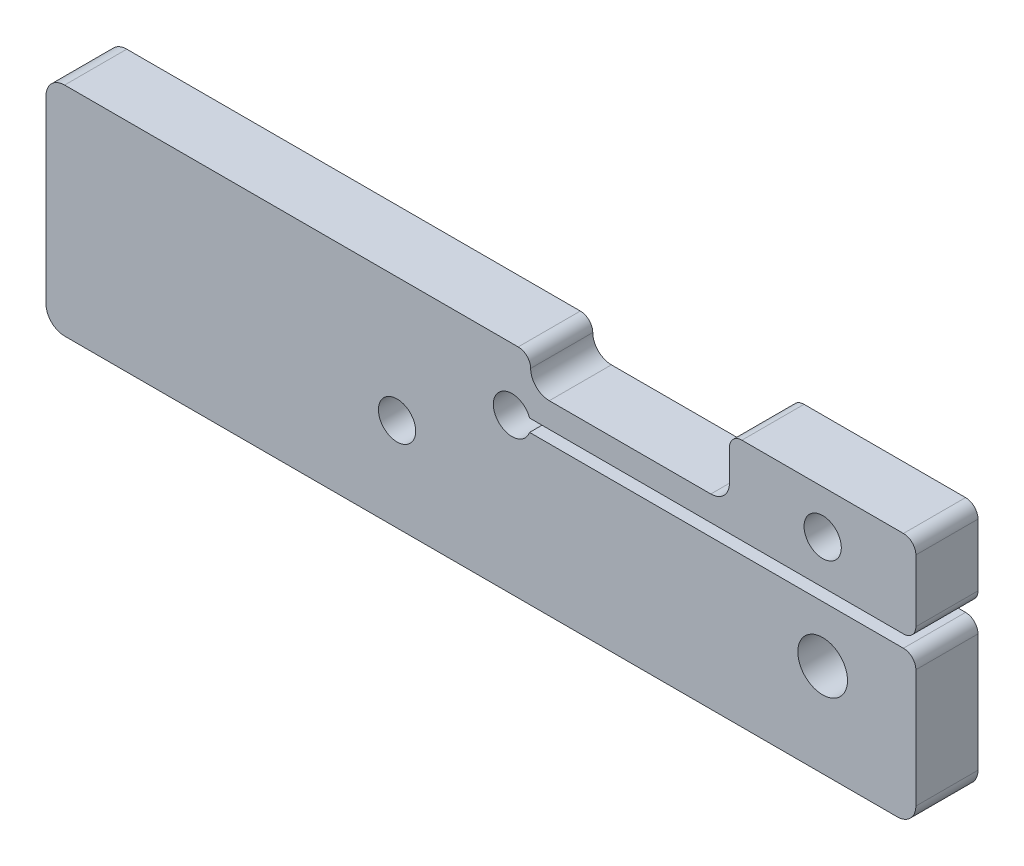
ISO-10303-21;
HEADER;
FILE_DESCRIPTION(('STEP AP214'),'2;1');
FILE_NAME('part.step','',(''),(''),'','','');
FILE_SCHEMA(('AUTOMOTIVE_DESIGN { 1 0 10303 214 1 1 1 1 }'));
ENDSEC;
DATA;
#1=APPLICATION_CONTEXT('core data for automotive mechanical design processes');
#2=APPLICATION_PROTOCOL_DEFINITION('international standard','automotive_design',2000,#1);
#3=PRODUCT_CONTEXT('',#1,'mechanical');
#4=PRODUCT('Part','Part','',(#3));
#5=PRODUCT_RELATED_PRODUCT_CATEGORY('part','',(#4));
#6=PRODUCT_DEFINITION_FORMATION('','',#4);
#7=PRODUCT_DEFINITION_CONTEXT('part definition',#1,'design');
#8=PRODUCT_DEFINITION('design','',#6,#7);
#9=PRODUCT_DEFINITION_SHAPE('','',#8);
#10=(LENGTH_UNIT() NAMED_UNIT(*) SI_UNIT(.MILLI.,.METRE.));
#11=(NAMED_UNIT(*) PLANE_ANGLE_UNIT() SI_UNIT($,.RADIAN.));
#12=(NAMED_UNIT(*) SI_UNIT($,.STERADIAN.) SOLID_ANGLE_UNIT());
#13=UNCERTAINTY_MEASURE_WITH_UNIT(LENGTH_MEASURE(1.E-05),#10,'distance_accuracy_value','');
#14=(GEOMETRIC_REPRESENTATION_CONTEXT(3) GLOBAL_UNCERTAINTY_ASSIGNED_CONTEXT((#13)) GLOBAL_UNIT_ASSIGNED_CONTEXT((#10,
#11,#12)) REPRESENTATION_CONTEXT('',''));
#15=CARTESIAN_POINT('',(0.,0.,0.));
#16=DIRECTION('',(0.,0.,1.));
#17=DIRECTION('',(1.,0.,0.));
#18=AXIS2_PLACEMENT_3D('',#15,#16,#17);
#19=CARTESIAN_POINT('',(140.,0.,30.));
#20=DIRECTION('',(-1.,0.,0.));
#21=DIRECTION('',(0.,0.,1.));
#22=AXIS2_PLACEMENT_3D('',#19,#20,#21);
#23=PLANE('',#22);
#24=DIRECTION('',(0.,0.,1.));
#25=VECTOR('',#24,1.);
#26=CARTESIAN_POINT('',(140.,22.,30.));
#27=LINE('',#26,#25);
#28=CARTESIAN_POINT('',(140.,22.,0.));
#29=VERTEX_POINT('',#28);
#30=CARTESIAN_POINT('',(140.,22.,10.));
#31=VERTEX_POINT('',#30);
#32=EDGE_CURVE('E235',#29,#31,#27,.T.);
#33=ORIENTED_EDGE('',*,*,#32,.T.);
#34=DIRECTION('',(0.,1.,0.));
#35=VECTOR('',#34,1.);
#36=CARTESIAN_POINT('',(140.,0.,10.));
#37=LINE('',#36,#35);
#38=CARTESIAN_POINT('',(140.,3.,10.));
#39=VERTEX_POINT('',#38);
#40=EDGE_CURVE('E449',#39,#31,#37,.T.);
#41=ORIENTED_EDGE('',*,*,#40,.F.);
#42=DIRECTION('',(0.,0.,-1.));
#43=VECTOR('',#42,1.);
#44=CARTESIAN_POINT('',(140.,3.,30.));
#45=LINE('',#44,#43);
#46=CARTESIAN_POINT('',(140.,3.,0.));
#47=VERTEX_POINT('',#46);
#48=EDGE_CURVE('E355',#39,#47,#45,.T.);
#49=ORIENTED_EDGE('',*,*,#48,.T.);
#50=DIRECTION('',(0.,1.,0.));
#51=VECTOR('',#50,1.);
#52=CARTESIAN_POINT('',(140.,0.,0.));
#53=LINE('',#52,#51);
#54=EDGE_CURVE('E325',#47,#29,#53,.T.);
#55=ORIENTED_EDGE('',*,*,#54,.T.);
#56=EDGE_LOOP('',(#33,#41,#49,#55));
#57=FACE_BOUND('',#56,.T.);
#58=ADVANCED_FACE('F32',(#57),#23,.F.);
#59=DIRECTION('',(0.,0.,1.));
#60=VECTOR('',#59,1.);
#61=CARTESIAN_POINT('',(140.,38.,30.));
#62=LINE('',#61,#60);
#63=CARTESIAN_POINT('',(140.,38.,0.));
#64=VERTEX_POINT('',#63);
#65=CARTESIAN_POINT('',(140.,38.,10.));
#66=VERTEX_POINT('',#65);
#67=EDGE_CURVE('E230',#64,#66,#62,.T.);
#68=ORIENTED_EDGE('',*,*,#67,.T.);
#69=CARTESIAN_POINT('',(140.,28.,10.));
#70=VERTEX_POINT('',#69);
#71=EDGE_CURVE('E48',#70,#66,#37,.T.);
#72=ORIENTED_EDGE('',*,*,#71,.F.);
#73=DIRECTION('',(0.,0.,1.));
#74=VECTOR('',#73,1.);
#75=CARTESIAN_POINT('',(140.,28.,30.));
#76=LINE('',#75,#74);
#77=CARTESIAN_POINT('',(140.,28.,0.));
#78=VERTEX_POINT('',#77);
#79=EDGE_CURVE('E233',#70,#78,#76,.F.);
#80=ORIENTED_EDGE('',*,*,#79,.T.);
#81=EDGE_CURVE('E324',#78,#64,#53,.T.);
#82=ORIENTED_EDGE('',*,*,#81,.T.);
#83=EDGE_LOOP('',(#68,#72,#80,#82));
#84=FACE_BOUND('',#83,.T.);
#85=ADVANCED_FACE('F385',(#84),#23,.F.);
#86=CARTESIAN_POINT('',(0.,35.,30.));
#87=DIRECTION('',(0.,-1.,0.));
#88=DIRECTION('',(0.,0.,-1.));
#89=AXIS2_PLACEMENT_3D('',#86,#87,#88);
#90=PLANE('',#89);
#91=DIRECTION('',(0.,0.,-1.));
#92=VECTOR('',#91,1.);
#93=CARTESIAN_POINT('',(3.,35.,30.));
#94=LINE('',#93,#92);
#95=CARTESIAN_POINT('',(3.,35.,0.));
#96=VERTEX_POINT('',#95);
#97=CARTESIAN_POINT('',(3.,35.,10.));
#98=VERTEX_POINT('',#97);
#99=EDGE_CURVE('E206',#96,#98,#94,.F.);
#100=ORIENTED_EDGE('',*,*,#99,.T.);
#101=DIRECTION('',(-1.,0.,0.));
#102=VECTOR('',#101,1.);
#103=CARTESIAN_POINT('',(8.5,35.,10.));
#104=LINE('',#103,#102);
#105=CARTESIAN_POINT('',(76.,35.,10.));
#106=VERTEX_POINT('',#105);
#107=EDGE_CURVE('E182',#106,#98,#104,.T.);
#108=ORIENTED_EDGE('',*,*,#107,.F.);
#109=DIRECTION('',(0.,0.,1.));
#110=VECTOR('',#109,1.);
#111=CARTESIAN_POINT('',(76.,35.,30.));
#112=LINE('',#111,#110);
#113=CARTESIAN_POINT('',(76.,35.,0.));
#114=VERTEX_POINT('',#113);
#115=EDGE_CURVE('E213',#106,#114,#112,.F.);
#116=ORIENTED_EDGE('',*,*,#115,.T.);
#117=DIRECTION('',(-1.,0.,0.));
#118=VECTOR('',#117,1.);
#119=CARTESIAN_POINT('',(0.,35.,0.));
#120=LINE('',#119,#118);
#121=EDGE_CURVE('E328',#114,#96,#120,.T.);
#122=ORIENTED_EDGE('',*,*,#121,.T.);
#123=EDGE_LOOP('',(#100,#108,#116,#122));
#124=FACE_BOUND('',#123,.T.);
#125=ADVANCED_FACE('F381',(#124),#90,.F.);
#126=CARTESIAN_POINT('',(0.,0.,30.));
#127=DIRECTION('',(1.,0.,0.));
#128=DIRECTION('',(0.,0.,-1.));
#129=AXIS2_PLACEMENT_3D('',#126,#127,#128);
#130=PLANE('',#129);
#131=DIRECTION('',(0.,0.,-1.));
#132=VECTOR('',#131,1.);
#133=CARTESIAN_POINT('',(0.,3.,30.));
#134=LINE('',#133,#132);
#135=CARTESIAN_POINT('',(0.,3.,0.));
#136=VERTEX_POINT('',#135);
#137=CARTESIAN_POINT('',(0.,3.,10.));
#138=VERTEX_POINT('',#137);
#139=EDGE_CURVE('E197',#136,#138,#134,.F.);
#140=ORIENTED_EDGE('',*,*,#139,.T.);
#141=DIRECTION('',(0.,-1.,0.));
#142=VECTOR('',#141,1.);
#143=CARTESIAN_POINT('',(0.,0.,10.));
#144=LINE('',#143,#142);
#145=CARTESIAN_POINT('',(0.,32.,10.));
#146=VERTEX_POINT('',#145);
#147=EDGE_CURVE('E180',#146,#138,#144,.T.);
#148=ORIENTED_EDGE('',*,*,#147,.F.);
#149=DIRECTION('',(0.,0.,-1.));
#150=VECTOR('',#149,1.);
#151=CARTESIAN_POINT('',(0.,32.,30.));
#152=LINE('',#151,#150);
#153=CARTESIAN_POINT('',(0.,32.,0.));
#154=VERTEX_POINT('',#153);
#155=EDGE_CURVE('E194',#146,#154,#152,.T.);
#156=ORIENTED_EDGE('',*,*,#155,.T.);
#157=DIRECTION('',(0.,-1.,0.));
#158=VECTOR('',#157,1.);
#159=CARTESIAN_POINT('',(0.,0.,0.));
#160=LINE('',#159,#158);
#161=EDGE_CURVE('E319',#154,#136,#160,.T.);
#162=ORIENTED_EDGE('',*,*,#161,.T.);
#163=EDGE_LOOP('',(#140,#148,#156,#162));
#164=FACE_BOUND('',#163,.T.);
#165=ADVANCED_FACE('F192',(#164),#130,.F.);
#166=CARTESIAN_POINT('',(0.,0.,30.));
#167=DIRECTION('',(0.,1.,0.));
#168=DIRECTION('',(0.,0.,1.));
#169=AXIS2_PLACEMENT_3D('',#166,#167,#168);
#170=PLANE('',#169);
#171=DIRECTION('',(0.,0.,-1.));
#172=VECTOR('',#171,1.);
#173=CARTESIAN_POINT('',(137.,0.,30.));
#174=LINE('',#173,#172);
#175=CARTESIAN_POINT('',(137.,0.,0.));
#176=VERTEX_POINT('',#175);
#177=CARTESIAN_POINT('',(137.,0.,10.));
#178=VERTEX_POINT('',#177);
#179=EDGE_CURVE('E352',#176,#178,#174,.F.);
#180=ORIENTED_EDGE('',*,*,#179,.T.);
#181=DIRECTION('',(1.,0.,0.));
#182=VECTOR('',#181,1.);
#183=CARTESIAN_POINT('',(8.5,0.,10.));
#184=LINE('',#183,#182);
#185=CARTESIAN_POINT('',(3.,0.,10.));
#186=VERTEX_POINT('',#185);
#187=EDGE_CURVE('E316',#186,#178,#184,.T.);
#188=ORIENTED_EDGE('',*,*,#187,.F.);
#189=DIRECTION('',(0.,0.,-1.));
#190=VECTOR('',#189,1.);
#191=CARTESIAN_POINT('',(3.,0.,30.));
#192=LINE('',#191,#190);
#193=CARTESIAN_POINT('',(3.,0.,0.));
#194=VERTEX_POINT('',#193);
#195=EDGE_CURVE('E350',#186,#194,#192,.T.);
#196=ORIENTED_EDGE('',*,*,#195,.T.);
#197=DIRECTION('',(1.,0.,0.));
#198=VECTOR('',#197,1.);
#199=CARTESIAN_POINT('',(0.,0.,0.));
#200=LINE('',#199,#198);
#201=EDGE_CURVE('E321',#194,#176,#200,.T.);
#202=ORIENTED_EDGE('',*,*,#201,.T.);
#203=EDGE_LOOP('',(#180,#188,#196,#202));
#204=FACE_BOUND('',#203,.T.);
#205=ADVANCED_FACE('F372',(#204),#170,.F.);
#206=CARTESIAN_POINT('',(0.,0.,0.));
#207=DIRECTION('',(0.,0.,-1.));
#208=DIRECTION('',(-1.,0.,0.));
#209=AXIS2_PLACEMENT_3D('',#206,#207,#208);
#210=PLANE('',#209);
#211=CARTESIAN_POINT('',(56.5,15.,0.));
#212=DIRECTION('',(0.,0.,1.));
#213=DIRECTION('',(1.,0.,0.));
#214=AXIS2_PLACEMENT_3D('',#211,#212,#213);
#215=CIRCLE('',#214,3.);
#216=CARTESIAN_POINT('',(59.5,15.,0.));
#217=VERTEX_POINT('',#216);
#218=EDGE_CURVE('E294',#217,#217,#215,.T.);
#219=ORIENTED_EDGE('',*,*,#218,.T.);
#220=EDGE_LOOP('',(#219));
#221=FACE_BOUND('',#220,.T.);
#222=CARTESIAN_POINT('',(125.,33.,0.));
#223=DIRECTION('',(0.,0.,1.));
#224=DIRECTION('',(1.,0.,0.));
#225=AXIS2_PLACEMENT_3D('',#222,#223,#224);
#226=CIRCLE('',#225,2.99999999999999);
#227=CARTESIAN_POINT('',(128.,33.,0.));
#228=VERTEX_POINT('',#227);
#229=EDGE_CURVE('E293',#228,#228,#226,.T.);
#230=ORIENTED_EDGE('',*,*,#229,.T.);
#231=EDGE_LOOP('',(#230));
#232=FACE_BOUND('',#231,.T.);
#233=CARTESIAN_POINT('',(125.,15.,0.));
#234=DIRECTION('',(0.,0.,1.));
#235=DIRECTION('',(1.,0.,0.));
#236=AXIS2_PLACEMENT_3D('',#233,#234,#235);
#237=CIRCLE('',#236,3.99999999999996);
#238=CARTESIAN_POINT('',(129.,15.,0.));
#239=VERTEX_POINT('',#238);
#240=EDGE_CURVE('E297',#239,#239,#237,.T.);
#241=ORIENTED_EDGE('',*,*,#240,.T.);
#242=EDGE_LOOP('',(#241));
#243=FACE_BOUND('',#242,.T.);
#244=ORIENTED_EDGE('',*,*,#121,.F.);
#245=CARTESIAN_POINT('',(76.,33.,0.));
#246=DIRECTION('',(0.,0.,-1.));
#247=DIRECTION('',(-1.,0.,0.));
#248=AXIS2_PLACEMENT_3D('',#245,#246,#247);
#249=CIRCLE('',#248,2.);
#250=CARTESIAN_POINT('',(78.,33.,0.));
#251=VERTEX_POINT('',#250);
#252=EDGE_CURVE('E224',#114,#251,#249,.T.);
#253=ORIENTED_EDGE('',*,*,#252,.T.);
#254=CARTESIAN_POINT('',(81.,33.,0.));
#255=DIRECTION('',(0.,0.,-1.));
#256=DIRECTION('',(-1.,0.,0.));
#257=AXIS2_PLACEMENT_3D('',#254,#255,#256);
#258=CIRCLE('',#257,3.);
#259=CARTESIAN_POINT('',(81.,30.,0.));
#260=VERTEX_POINT('',#259);
#261=EDGE_CURVE('E348',#251,#260,#258,.F.);
#262=ORIENTED_EDGE('',*,*,#261,.T.);
#263=DIRECTION('',(1.,0.,0.));
#264=VECTOR('',#263,1.);
#265=CARTESIAN_POINT('',(78.,30.,0.));
#266=LINE('',#265,#264);
#267=CARTESIAN_POINT('',(107.,30.,0.));
#268=VERTEX_POINT('',#267);
#269=EDGE_CURVE('E302',#260,#268,#266,.T.);
#270=ORIENTED_EDGE('',*,*,#269,.T.);
#271=CARTESIAN_POINT('',(107.,33.,0.));
#272=DIRECTION('',(0.,0.,-1.));
#273=DIRECTION('',(-1.,0.,0.));
#274=AXIS2_PLACEMENT_3D('',#271,#272,#273);
#275=CIRCLE('',#274,3.);
#276=CARTESIAN_POINT('',(110.,33.,0.));
#277=VERTEX_POINT('',#276);
#278=EDGE_CURVE('E345',#268,#277,#275,.F.);
#279=ORIENTED_EDGE('',*,*,#278,.T.);
#280=DIRECTION('',(0.,-1.,0.));
#281=VECTOR('',#280,1.);
#282=CARTESIAN_POINT('',(110.,35.,0.));
#283=LINE('',#282,#281);
#284=CARTESIAN_POINT('',(110.,38.,0.));
#285=VERTEX_POINT('',#284);
#286=EDGE_CURVE('E313',#285,#277,#283,.T.);
#287=ORIENTED_EDGE('',*,*,#286,.F.);
#288=CARTESIAN_POINT('',(112.,38.,0.));
#289=DIRECTION('',(0.,0.,-1.));
#290=DIRECTION('',(-1.,0.,0.));
#291=AXIS2_PLACEMENT_3D('',#288,#289,#290);
#292=CIRCLE('',#291,2.);
#293=CARTESIAN_POINT('',(112.,40.,0.));
#294=VERTEX_POINT('',#293);
#295=EDGE_CURVE('E219',#285,#294,#292,.T.);
#296=ORIENTED_EDGE('',*,*,#295,.T.);
#297=DIRECTION('',(-1.,0.,0.));
#298=VECTOR('',#297,1.);
#299=CARTESIAN_POINT('',(110.,40.,0.));
#300=LINE('',#299,#298);
#301=CARTESIAN_POINT('',(138.,40.,0.));
#302=VERTEX_POINT('',#301);
#303=EDGE_CURVE('E248',#302,#294,#300,.T.);
#304=ORIENTED_EDGE('',*,*,#303,.F.);
#305=CARTESIAN_POINT('',(138.,38.,0.));
#306=DIRECTION('',(0.,0.,-1.));
#307=DIRECTION('',(-1.,0.,0.));
#308=AXIS2_PLACEMENT_3D('',#305,#306,#307);
#309=CIRCLE('',#308,2.);
#310=EDGE_CURVE('E217',#302,#64,#309,.T.);
#311=ORIENTED_EDGE('',*,*,#310,.T.);
#312=ORIENTED_EDGE('',*,*,#81,.F.);
#313=CARTESIAN_POINT('',(138.,28.,0.));
#314=DIRECTION('',(0.,0.,-1.));
#315=DIRECTION('',(-1.,0.,0.));
#316=AXIS2_PLACEMENT_3D('',#313,#314,#315);
#317=CIRCLE('',#316,2.);
#318=CARTESIAN_POINT('',(138.,26.,0.));
#319=VERTEX_POINT('',#318);
#320=EDGE_CURVE('E56',#78,#319,#317,.T.);
#321=ORIENTED_EDGE('',*,*,#320,.T.);
#322=DIRECTION('',(-1.,0.,0.));
#323=VECTOR('',#322,1.);
#324=CARTESIAN_POINT('',(140.,26.,0.));
#325=LINE('',#324,#323);
#326=CARTESIAN_POINT('',(77.8284271247462,26.,0.));
#327=VERTEX_POINT('',#326);
#328=EDGE_CURVE('E305',#319,#327,#325,.T.);
#329=ORIENTED_EDGE('',*,*,#328,.T.);
#330=CARTESIAN_POINT('',(75.,25.,0.));
#331=DIRECTION('',(0.,0.,1.));
#332=DIRECTION('',(1.,0.,0.));
#333=AXIS2_PLACEMENT_3D('',#330,#331,#332);
#334=CIRCLE('',#333,3.00000000000001);
#335=CARTESIAN_POINT('',(77.8284271247462,24.,0.));
#336=VERTEX_POINT('',#335);
#337=EDGE_CURVE('E310',#327,#336,#334,.T.);
#338=ORIENTED_EDGE('',*,*,#337,.T.);
#339=DIRECTION('',(1.,0.,0.));
#340=VECTOR('',#339,1.);
#341=CARTESIAN_POINT('',(140.,24.,0.));
#342=LINE('',#341,#340);
#343=CARTESIAN_POINT('',(138.,24.,0.));
#344=VERTEX_POINT('',#343);
#345=EDGE_CURVE('E307',#336,#344,#342,.T.);
#346=ORIENTED_EDGE('',*,*,#345,.T.);
#347=CARTESIAN_POINT('',(138.,22.,0.));
#348=DIRECTION('',(0.,0.,-1.));
#349=DIRECTION('',(-1.,0.,0.));
#350=AXIS2_PLACEMENT_3D('',#347,#348,#349);
#351=CIRCLE('',#350,2.);
#352=EDGE_CURVE('E221',#344,#29,#351,.T.);
#353=ORIENTED_EDGE('',*,*,#352,.T.);
#354=ORIENTED_EDGE('',*,*,#54,.F.);
#355=CARTESIAN_POINT('',(137.,3.,0.));
#356=DIRECTION('',(0.,0.,-1.));
#357=DIRECTION('',(-1.,0.,0.));
#358=AXIS2_PLACEMENT_3D('',#355,#356,#357);
#359=CIRCLE('',#358,3.);
#360=EDGE_CURVE('E204',#47,#176,#359,.T.);
#361=ORIENTED_EDGE('',*,*,#360,.T.);
#362=ORIENTED_EDGE('',*,*,#201,.F.);
#363=CARTESIAN_POINT('',(3.,3.,0.));
#364=DIRECTION('',(0.,0.,-1.));
#365=DIRECTION('',(-1.,0.,0.));
#366=AXIS2_PLACEMENT_3D('',#363,#364,#365);
#367=CIRCLE('',#366,3.);
#368=EDGE_CURVE('E208',#194,#136,#367,.T.);
#369=ORIENTED_EDGE('',*,*,#368,.T.);
#370=ORIENTED_EDGE('',*,*,#161,.F.);
#371=CARTESIAN_POINT('',(3.,32.,0.));
#372=DIRECTION('',(0.,0.,-1.));
#373=DIRECTION('',(-1.,0.,0.));
#374=AXIS2_PLACEMENT_3D('',#371,#372,#373);
#375=CIRCLE('',#374,3.);
#376=EDGE_CURVE('E202',#154,#96,#375,.T.);
#377=ORIENTED_EDGE('',*,*,#376,.T.);
#378=EDGE_LOOP('',(#244,#253,#262,#270,#279,#287,#296,#304,#311,#312,#321,#329,#338,#346,#353,
#354,#361,#362,#369,#370,#377));
#379=FACE_BOUND('',#378,.T.);
#380=ADVANCED_FACE('F360',(#221,#232,#243,#379),#210,.T.);
#381=CARTESIAN_POINT('',(0.,0.,10.));
#382=DIRECTION('',(0.,0.,-1.));
#383=DIRECTION('',(-1.,0.,0.));
#384=AXIS2_PLACEMENT_3D('',#381,#382,#383);
#385=PLANE('',#384);
#386=CARTESIAN_POINT('',(76.,33.,10.));
#387=DIRECTION('',(0.,0.,-1.));
#388=DIRECTION('',(-1.,0.,0.));
#389=AXIS2_PLACEMENT_3D('',#386,#387,#388);
#390=CIRCLE('',#389,2.);
#391=CARTESIAN_POINT('',(78.,33.,10.));
#392=VERTEX_POINT('',#391);
#393=EDGE_CURVE('E188',#392,#106,#390,.F.);
#394=ORIENTED_EDGE('',*,*,#393,.T.);
#395=ORIENTED_EDGE('',*,*,#107,.T.);
#396=CARTESIAN_POINT('',(3.,32.,10.));
#397=DIRECTION('',(0.,0.,-1.));
#398=DIRECTION('',(-1.,0.,0.));
#399=AXIS2_PLACEMENT_3D('',#396,#397,#398);
#400=CIRCLE('',#399,3.);
#401=EDGE_CURVE('E174',#98,#146,#400,.F.);
#402=ORIENTED_EDGE('',*,*,#401,.T.);
#403=ORIENTED_EDGE('',*,*,#147,.T.);
#404=CARTESIAN_POINT('',(3.,3.,10.));
#405=DIRECTION('',(0.,0.,-1.));
#406=DIRECTION('',(-1.,0.,0.));
#407=AXIS2_PLACEMENT_3D('',#404,#405,#406);
#408=CIRCLE('',#407,3.);
#409=EDGE_CURVE('E286',#138,#186,#408,.F.);
#410=ORIENTED_EDGE('',*,*,#409,.T.);
#411=ORIENTED_EDGE('',*,*,#187,.T.);
#412=CARTESIAN_POINT('',(137.,3.,10.));
#413=DIRECTION('',(0.,0.,-1.));
#414=DIRECTION('',(-1.,0.,0.));
#415=AXIS2_PLACEMENT_3D('',#412,#413,#414);
#416=CIRCLE('',#415,3.);
#417=EDGE_CURVE('E288',#178,#39,#416,.F.);
#418=ORIENTED_EDGE('',*,*,#417,.T.);
#419=ORIENTED_EDGE('',*,*,#40,.T.);
#420=CARTESIAN_POINT('',(138.,22.,10.));
#421=DIRECTION('',(0.,0.,-1.));
#422=DIRECTION('',(-1.,0.,0.));
#423=AXIS2_PLACEMENT_3D('',#420,#421,#422);
#424=CIRCLE('',#423,2.);
#425=CARTESIAN_POINT('',(138.,24.,10.));
#426=VERTEX_POINT('',#425);
#427=EDGE_CURVE('E187',#31,#426,#424,.F.);
#428=ORIENTED_EDGE('',*,*,#427,.T.);
#429=DIRECTION('',(1.,0.,0.));
#430=VECTOR('',#429,1.);
#431=CARTESIAN_POINT('',(140.,24.,10.));
#432=LINE('',#431,#430);
#433=CARTESIAN_POINT('',(77.8284271247462,24.,10.));
#434=VERTEX_POINT('',#433);
#435=EDGE_CURVE('E275',#434,#426,#432,.T.);
#436=ORIENTED_EDGE('',*,*,#435,.F.);
#437=CARTESIAN_POINT('',(75.,25.,10.));
#438=DIRECTION('',(0.,0.,-1.));
#439=DIRECTION('',(-1.,0.,0.));
#440=AXIS2_PLACEMENT_3D('',#437,#438,#439);
#441=CIRCLE('',#440,3.00000000000001);
#442=CARTESIAN_POINT('',(77.8284271247462,26.,10.));
#443=VERTEX_POINT('',#442);
#444=EDGE_CURVE('E278',#443,#434,#441,.F.);
#445=ORIENTED_EDGE('',*,*,#444,.F.);
#446=DIRECTION('',(-1.,0.,0.));
#447=VECTOR('',#446,1.);
#448=CARTESIAN_POINT('',(140.,26.,10.));
#449=LINE('',#448,#447);
#450=CARTESIAN_POINT('',(138.,26.,10.));
#451=VERTEX_POINT('',#450);
#452=EDGE_CURVE('E281',#451,#443,#449,.T.);
#453=ORIENTED_EDGE('',*,*,#452,.F.);
#454=CARTESIAN_POINT('',(138.,28.,10.));
#455=DIRECTION('',(0.,0.,-1.));
#456=DIRECTION('',(-1.,0.,0.));
#457=AXIS2_PLACEMENT_3D('',#454,#455,#456);
#458=CIRCLE('',#457,2.);
#459=EDGE_CURVE('E284',#451,#70,#458,.F.);
#460=ORIENTED_EDGE('',*,*,#459,.T.);
#461=ORIENTED_EDGE('',*,*,#71,.T.);
#462=CARTESIAN_POINT('',(138.,38.,10.));
#463=DIRECTION('',(0.,0.,-1.));
#464=DIRECTION('',(-1.,0.,0.));
#465=AXIS2_PLACEMENT_3D('',#462,#463,#464);
#466=CIRCLE('',#465,2.);
#467=CARTESIAN_POINT('',(138.,40.,10.));
#468=VERTEX_POINT('',#467);
#469=EDGE_CURVE('E257',#66,#468,#466,.F.);
#470=ORIENTED_EDGE('',*,*,#469,.T.);
#471=DIRECTION('',(-1.,0.,0.));
#472=VECTOR('',#471,1.);
#473=CARTESIAN_POINT('',(0.,40.,10.));
#474=LINE('',#473,#472);
#475=CARTESIAN_POINT('',(112.,40.,10.));
#476=VERTEX_POINT('',#475);
#477=EDGE_CURVE('E198',#468,#476,#474,.T.);
#478=ORIENTED_EDGE('',*,*,#477,.T.);
#479=CARTESIAN_POINT('',(112.,38.,10.));
#480=DIRECTION('',(0.,0.,-1.));
#481=DIRECTION('',(-1.,0.,0.));
#482=AXIS2_PLACEMENT_3D('',#479,#480,#481);
#483=CIRCLE('',#482,2.);
#484=CARTESIAN_POINT('',(110.,38.,10.));
#485=VERTEX_POINT('',#484);
#486=EDGE_CURVE('E254',#476,#485,#483,.F.);
#487=ORIENTED_EDGE('',*,*,#486,.T.);
#488=DIRECTION('',(0.,-1.,0.));
#489=VECTOR('',#488,1.);
#490=CARTESIAN_POINT('',(110.,35.,10.));
#491=LINE('',#490,#489);
#492=CARTESIAN_POINT('',(110.,33.,10.));
#493=VERTEX_POINT('',#492);
#494=EDGE_CURVE('E256',#485,#493,#491,.T.);
#495=ORIENTED_EDGE('',*,*,#494,.T.);
#496=CARTESIAN_POINT('',(107.,33.,10.));
#497=DIRECTION('',(0.,0.,-1.));
#498=DIRECTION('',(-1.,0.,0.));
#499=AXIS2_PLACEMENT_3D('',#496,#497,#498);
#500=CIRCLE('',#499,3.);
#501=CARTESIAN_POINT('',(107.,30.,10.));
#502=VERTEX_POINT('',#501);
#503=EDGE_CURVE('E259',#502,#493,#500,.F.);
#504=ORIENTED_EDGE('',*,*,#503,.F.);
#505=DIRECTION('',(1.,0.,0.));
#506=VECTOR('',#505,1.);
#507=CARTESIAN_POINT('',(78.,30.,10.));
#508=LINE('',#507,#506);
#509=CARTESIAN_POINT('',(81.,30.,10.));
#510=VERTEX_POINT('',#509);
#511=EDGE_CURVE('E267',#510,#502,#508,.T.);
#512=ORIENTED_EDGE('',*,*,#511,.F.);
#513=CARTESIAN_POINT('',(81.,33.,10.));
#514=DIRECTION('',(0.,0.,-1.));
#515=DIRECTION('',(-1.,0.,0.));
#516=AXIS2_PLACEMENT_3D('',#513,#514,#515);
#517=CIRCLE('',#516,3.);
#518=EDGE_CURVE('E270',#392,#510,#517,.F.);
#519=ORIENTED_EDGE('',*,*,#518,.F.);
#520=EDGE_LOOP('',(#394,#395,#402,#403,#410,#411,#418,#419,#428,#436,#445,#453,#460,#461,#470,
#478,#487,#495,#504,#512,#519));
#521=FACE_BOUND('',#520,.T.);
#522=CARTESIAN_POINT('',(125.,33.,10.));
#523=DIRECTION('',(0.,0.,-1.));
#524=DIRECTION('',(-1.,0.,0.));
#525=AXIS2_PLACEMENT_3D('',#522,#523,#524);
#526=CIRCLE('',#525,2.99999999999999);
#527=CARTESIAN_POINT('',(122.,33.,10.));
#528=VERTEX_POINT('',#527);
#529=EDGE_CURVE('E261',#528,#528,#526,.F.);
#530=ORIENTED_EDGE('',*,*,#529,.F.);
#531=EDGE_LOOP('',(#530));
#532=FACE_BOUND('',#531,.T.);
#533=CARTESIAN_POINT('',(56.5,15.,10.));
#534=DIRECTION('',(0.,0.,-1.));
#535=DIRECTION('',(-1.,0.,0.));
#536=AXIS2_PLACEMENT_3D('',#533,#534,#535);
#537=CIRCLE('',#536,3.);
#538=CARTESIAN_POINT('',(53.5,15.,10.));
#539=VERTEX_POINT('',#538);
#540=EDGE_CURVE('E36',#539,#539,#537,.F.);
#541=ORIENTED_EDGE('',*,*,#540,.F.);
#542=EDGE_LOOP('',(#541));
#543=FACE_BOUND('',#542,.T.);
#544=CARTESIAN_POINT('',(125.,15.,10.));
#545=DIRECTION('',(0.,0.,-1.));
#546=DIRECTION('',(-1.,0.,0.));
#547=AXIS2_PLACEMENT_3D('',#544,#545,#546);
#548=CIRCLE('',#547,3.99999999999996);
#549=CARTESIAN_POINT('',(121.,15.,10.));
#550=VERTEX_POINT('',#549);
#551=EDGE_CURVE('E290',#550,#550,#548,.F.);
#552=ORIENTED_EDGE('',*,*,#551,.F.);
#553=EDGE_LOOP('',(#552));
#554=FACE_BOUND('',#553,.T.);
#555=ADVANCED_FACE('F177',(#521,#532,#543,#554),#385,.F.);
#556=CARTESIAN_POINT('',(110.,35.,0.));
#557=DIRECTION('',(-1.,0.,0.));
#558=DIRECTION('',(0.,0.,1.));
#559=AXIS2_PLACEMENT_3D('',#556,#557,#558);
#560=PLANE('',#559);
#561=ORIENTED_EDGE('',*,*,#494,.F.);
#562=DIRECTION('',(0.,0.,1.));
#563=VECTOR('',#562,1.);
#564=CARTESIAN_POINT('',(110.,38.,0.));
#565=LINE('',#564,#563);
#566=EDGE_CURVE('E11',#485,#285,#565,.F.);
#567=ORIENTED_EDGE('',*,*,#566,.T.);
#568=ORIENTED_EDGE('',*,*,#286,.T.);
#569=DIRECTION('',(0.,0.,1.));
#570=VECTOR('',#569,1.);
#571=CARTESIAN_POINT('',(110.,33.,0.));
#572=LINE('',#571,#570);
#573=EDGE_CURVE('E335',#277,#493,#572,.T.);
#574=ORIENTED_EDGE('',*,*,#573,.T.);
#575=EDGE_LOOP('',(#561,#567,#568,#574));
#576=FACE_BOUND('',#575,.T.);
#577=ADVANCED_FACE('F397',(#576),#560,.T.);
#578=CARTESIAN_POINT('',(110.,40.,0.));
#579=DIRECTION('',(0.,1.,0.));
#580=DIRECTION('',(0.,0.,1.));
#581=AXIS2_PLACEMENT_3D('',#578,#579,#580);
#582=PLANE('',#581);
#583=ORIENTED_EDGE('',*,*,#477,.F.);
#584=DIRECTION('',(0.,0.,1.));
#585=VECTOR('',#584,1.);
#586=CARTESIAN_POINT('',(138.,40.,0.));
#587=LINE('',#586,#585);
#588=EDGE_CURVE('E238',#468,#302,#587,.F.);
#589=ORIENTED_EDGE('',*,*,#588,.T.);
#590=ORIENTED_EDGE('',*,*,#303,.T.);
#591=DIRECTION('',(0.,0.,1.));
#592=VECTOR('',#591,1.);
#593=CARTESIAN_POINT('',(112.,40.,0.));
#594=LINE('',#593,#592);
#595=EDGE_CURVE('E41',#294,#476,#594,.T.);
#596=ORIENTED_EDGE('',*,*,#595,.T.);
#597=EDGE_LOOP('',(#583,#589,#590,#596));
#598=FACE_BOUND('',#597,.T.);
#599=ADVANCED_FACE('F245',(#598),#582,.T.);
#600=CARTESIAN_POINT('',(75.,25.,0.));
#601=DIRECTION('',(0.,0.,1.));
#602=DIRECTION('',(1.,0.,0.));
#603=AXIS2_PLACEMENT_3D('',#600,#601,#602);
#604=CYLINDRICAL_SURFACE('',#603,3.00000000000001);
#605=DIRECTION('',(0.,0.,1.));
#606=VECTOR('',#605,1.);
#607=CARTESIAN_POINT('',(77.8284271247462,26.,0.));
#608=LINE('',#607,#606);
#609=EDGE_CURVE('E332',#327,#443,#608,.T.);
#610=ORIENTED_EDGE('',*,*,#609,.T.);
#611=ORIENTED_EDGE('',*,*,#444,.T.);
#612=DIRECTION('',(0.,0.,1.));
#613=VECTOR('',#612,1.);
#614=CARTESIAN_POINT('',(77.8284271247462,24.,0.));
#615=LINE('',#614,#613);
#616=EDGE_CURVE('E330',#434,#336,#615,.F.);
#617=ORIENTED_EDGE('',*,*,#616,.T.);
#618=ORIENTED_EDGE('',*,*,#337,.F.);
#619=EDGE_LOOP('',(#610,#611,#617,#618));
#620=FACE_BOUND('',#619,.T.);
#621=ADVANCED_FACE('F403',(#620),#604,.F.);
#622=CARTESIAN_POINT('',(140.,24.,0.));
#623=DIRECTION('',(0.,-1.,0.));
#624=DIRECTION('',(1.,0.,0.));
#625=AXIS2_PLACEMENT_3D('',#622,#623,#624);
#626=PLANE('',#625);
#627=ORIENTED_EDGE('',*,*,#616,.F.);
#628=ORIENTED_EDGE('',*,*,#435,.T.);
#629=DIRECTION('',(0.,0.,1.));
#630=VECTOR('',#629,1.);
#631=CARTESIAN_POINT('',(138.,24.,0.));
#632=LINE('',#631,#630);
#633=EDGE_CURVE('E215',#426,#344,#632,.F.);
#634=ORIENTED_EDGE('',*,*,#633,.T.);
#635=ORIENTED_EDGE('',*,*,#345,.F.);
#636=EDGE_LOOP('',(#627,#628,#634,#635));
#637=FACE_BOUND('',#636,.T.);
#638=ADVANCED_FACE('F406',(#637),#626,.F.);
#639=CARTESIAN_POINT('',(140.,26.,0.));
#640=DIRECTION('',(0.,1.,0.));
#641=DIRECTION('',(-1.,0.,0.));
#642=AXIS2_PLACEMENT_3D('',#639,#640,#641);
#643=PLANE('',#642);
#644=DIRECTION('',(0.,0.,1.));
#645=VECTOR('',#644,1.);
#646=CARTESIAN_POINT('',(138.,26.,0.));
#647=LINE('',#646,#645);
#648=EDGE_CURVE('E227',#319,#451,#647,.T.);
#649=ORIENTED_EDGE('',*,*,#648,.T.);
#650=ORIENTED_EDGE('',*,*,#452,.T.);
#651=ORIENTED_EDGE('',*,*,#609,.F.);
#652=ORIENTED_EDGE('',*,*,#328,.F.);
#653=EDGE_LOOP('',(#649,#650,#651,#652));
#654=FACE_BOUND('',#653,.T.);
#655=ADVANCED_FACE('F408',(#654),#643,.F.);
#656=CARTESIAN_POINT('',(78.,30.,0.));
#657=DIRECTION('',(0.,-1.,0.));
#658=DIRECTION('',(0.,0.,-1.));
#659=AXIS2_PLACEMENT_3D('',#656,#657,#658);
#660=PLANE('',#659);
#661=DIRECTION('',(0.,0.,1.));
#662=VECTOR('',#661,1.);
#663=CARTESIAN_POINT('',(81.,30.,30.));
#664=LINE('',#663,#662);
#665=EDGE_CURVE('E338',#260,#510,#664,.T.);
#666=ORIENTED_EDGE('',*,*,#665,.T.);
#667=ORIENTED_EDGE('',*,*,#511,.T.);
#668=DIRECTION('',(0.,0.,1.));
#669=VECTOR('',#668,1.);
#670=CARTESIAN_POINT('',(107.,30.,0.));
#671=LINE('',#670,#669);
#672=EDGE_CURVE('E341',#502,#268,#671,.F.);
#673=ORIENTED_EDGE('',*,*,#672,.T.);
#674=ORIENTED_EDGE('',*,*,#269,.F.);
#675=EDGE_LOOP('',(#666,#667,#673,#674));
#676=FACE_BOUND('',#675,.T.);
#677=ADVANCED_FACE('F411',(#676),#660,.F.);
#678=CARTESIAN_POINT('',(107.,33.,0.));
#679=DIRECTION('',(0.,0.,1.));
#680=DIRECTION('',(1.,0.,0.));
#681=AXIS2_PLACEMENT_3D('',#678,#679,#680);
#682=CYLINDRICAL_SURFACE('',#681,3.);
#683=ORIENTED_EDGE('',*,*,#672,.F.);
#684=ORIENTED_EDGE('',*,*,#503,.T.);
#685=ORIENTED_EDGE('',*,*,#573,.F.);
#686=ORIENTED_EDGE('',*,*,#278,.F.);
#687=EDGE_LOOP('',(#683,#684,#685,#686));
#688=FACE_BOUND('',#687,.T.);
#689=ADVANCED_FACE('F418',(#688),#682,.F.);
#690=CARTESIAN_POINT('',(81.,33.,0.));
#691=DIRECTION('',(0.,0.,-1.));
#692=DIRECTION('',(-1.,0.,0.));
#693=AXIS2_PLACEMENT_3D('',#690,#691,#692);
#694=CYLINDRICAL_SURFACE('',#693,3.);
#695=DIRECTION('',(0.,0.,1.));
#696=VECTOR('',#695,1.);
#697=CARTESIAN_POINT('',(78.,33.,0.));
#698=LINE('',#697,#696);
#699=EDGE_CURVE('E343',#392,#251,#698,.F.);
#700=ORIENTED_EDGE('',*,*,#699,.F.);
#701=ORIENTED_EDGE('',*,*,#518,.T.);
#702=ORIENTED_EDGE('',*,*,#665,.F.);
#703=ORIENTED_EDGE('',*,*,#261,.F.);
#704=EDGE_LOOP('',(#700,#701,#702,#703));
#705=FACE_BOUND('',#704,.T.);
#706=ADVANCED_FACE('F423',(#705),#694,.F.);
#707=CARTESIAN_POINT('',(125.,15.,0.));
#708=DIRECTION('',(0.,0.,1.));
#709=DIRECTION('',(1.,0.,0.));
#710=AXIS2_PLACEMENT_3D('',#707,#708,#709);
#711=CYLINDRICAL_SURFACE('',#710,3.99999999999996);
#712=ORIENTED_EDGE('',*,*,#551,.T.);
#713=EDGE_LOOP('',(#712));
#714=FACE_BOUND('',#713,.T.);
#715=ORIENTED_EDGE('',*,*,#240,.F.);
#716=EDGE_LOOP('',(#715));
#717=FACE_BOUND('',#716,.T.);
#718=ADVANCED_FACE('F420',(#714,#717),#711,.F.);
#719=CARTESIAN_POINT('',(137.,3.,30.));
#720=DIRECTION('',(0.,0.,-1.));
#721=DIRECTION('',(-1.,0.,0.));
#722=AXIS2_PLACEMENT_3D('',#719,#720,#721);
#723=CYLINDRICAL_SURFACE('',#722,3.);
#724=ORIENTED_EDGE('',*,*,#417,.F.);
#725=ORIENTED_EDGE('',*,*,#179,.F.);
#726=ORIENTED_EDGE('',*,*,#360,.F.);
#727=ORIENTED_EDGE('',*,*,#48,.F.);
#728=EDGE_LOOP('',(#724,#725,#726,#727));
#729=FACE_BOUND('',#728,.T.);
#730=ADVANCED_FACE('F370',(#729),#723,.T.);
#731=CARTESIAN_POINT('',(3.,3.,30.));
#732=DIRECTION('',(0.,0.,-1.));
#733=DIRECTION('',(-1.,0.,0.));
#734=AXIS2_PLACEMENT_3D('',#731,#732,#733);
#735=CYLINDRICAL_SURFACE('',#734,3.);
#736=ORIENTED_EDGE('',*,*,#409,.F.);
#737=ORIENTED_EDGE('',*,*,#139,.F.);
#738=ORIENTED_EDGE('',*,*,#368,.F.);
#739=ORIENTED_EDGE('',*,*,#195,.F.);
#740=EDGE_LOOP('',(#736,#737,#738,#739));
#741=FACE_BOUND('',#740,.T.);
#742=ADVANCED_FACE('F363',(#741),#735,.T.);
#743=CARTESIAN_POINT('',(3.,32.,30.));
#744=DIRECTION('',(0.,0.,-1.));
#745=DIRECTION('',(-1.,0.,0.));
#746=AXIS2_PLACEMENT_3D('',#743,#744,#745);
#747=CYLINDRICAL_SURFACE('',#746,3.);
#748=ORIENTED_EDGE('',*,*,#401,.F.);
#749=ORIENTED_EDGE('',*,*,#99,.F.);
#750=ORIENTED_EDGE('',*,*,#376,.F.);
#751=ORIENTED_EDGE('',*,*,#155,.F.);
#752=EDGE_LOOP('',(#748,#749,#750,#751));
#753=FACE_BOUND('',#752,.T.);
#754=ADVANCED_FACE('F200',(#753),#747,.T.);
#755=CARTESIAN_POINT('',(76.,33.,0.));
#756=DIRECTION('',(0.,0.,1.));
#757=DIRECTION('',(1.,0.,0.));
#758=AXIS2_PLACEMENT_3D('',#755,#756,#757);
#759=CYLINDRICAL_SURFACE('',#758,2.);
#760=ORIENTED_EDGE('',*,*,#393,.F.);
#761=ORIENTED_EDGE('',*,*,#699,.T.);
#762=ORIENTED_EDGE('',*,*,#252,.F.);
#763=ORIENTED_EDGE('',*,*,#115,.F.);
#764=EDGE_LOOP('',(#760,#761,#762,#763));
#765=FACE_BOUND('',#764,.T.);
#766=ADVANCED_FACE('F481',(#765),#759,.T.);
#767=CARTESIAN_POINT('',(138.,28.,0.));
#768=DIRECTION('',(0.,0.,1.));
#769=DIRECTION('',(1.,0.,0.));
#770=AXIS2_PLACEMENT_3D('',#767,#768,#769);
#771=CYLINDRICAL_SURFACE('',#770,2.);
#772=ORIENTED_EDGE('',*,*,#459,.F.);
#773=ORIENTED_EDGE('',*,*,#648,.F.);
#774=ORIENTED_EDGE('',*,*,#320,.F.);
#775=ORIENTED_EDGE('',*,*,#79,.F.);
#776=EDGE_LOOP('',(#772,#773,#774,#775));
#777=FACE_BOUND('',#776,.T.);
#778=ADVANCED_FACE('F465',(#777),#771,.T.);
#779=CARTESIAN_POINT('',(138.,22.,30.));
#780=DIRECTION('',(0.,0.,1.));
#781=DIRECTION('',(1.,0.,0.));
#782=AXIS2_PLACEMENT_3D('',#779,#780,#781);
#783=CYLINDRICAL_SURFACE('',#782,2.);
#784=ORIENTED_EDGE('',*,*,#427,.F.);
#785=ORIENTED_EDGE('',*,*,#32,.F.);
#786=ORIENTED_EDGE('',*,*,#352,.F.);
#787=ORIENTED_EDGE('',*,*,#633,.F.);
#788=EDGE_LOOP('',(#784,#785,#786,#787));
#789=FACE_BOUND('',#788,.T.);
#790=ADVANCED_FACE('F454',(#789),#783,.T.);
#791=CARTESIAN_POINT('',(112.,38.,0.));
#792=DIRECTION('',(0.,0.,1.));
#793=DIRECTION('',(1.,0.,0.));
#794=AXIS2_PLACEMENT_3D('',#791,#792,#793);
#795=CYLINDRICAL_SURFACE('',#794,2.);
#796=ORIENTED_EDGE('',*,*,#486,.F.);
#797=ORIENTED_EDGE('',*,*,#595,.F.);
#798=ORIENTED_EDGE('',*,*,#295,.F.);
#799=ORIENTED_EDGE('',*,*,#566,.F.);
#800=EDGE_LOOP('',(#796,#797,#798,#799));
#801=FACE_BOUND('',#800,.T.);
#802=ADVANCED_FACE('F252',(#801),#795,.T.);
#803=CARTESIAN_POINT('',(138.,38.,30.));
#804=DIRECTION('',(0.,0.,-1.));
#805=DIRECTION('',(-1.,0.,0.));
#806=AXIS2_PLACEMENT_3D('',#803,#804,#805);
#807=CYLINDRICAL_SURFACE('',#806,2.);
#808=ORIENTED_EDGE('',*,*,#469,.F.);
#809=ORIENTED_EDGE('',*,*,#67,.F.);
#810=ORIENTED_EDGE('',*,*,#310,.F.);
#811=ORIENTED_EDGE('',*,*,#588,.F.);
#812=EDGE_LOOP('',(#808,#809,#810,#811));
#813=FACE_BOUND('',#812,.T.);
#814=ADVANCED_FACE('F34',(#813),#807,.T.);
#815=CARTESIAN_POINT('',(125.,33.,0.));
#816=DIRECTION('',(0.,0.,1.));
#817=DIRECTION('',(1.,0.,0.));
#818=AXIS2_PLACEMENT_3D('',#815,#816,#817);
#819=CYLINDRICAL_SURFACE('',#818,2.99999999999999);
#820=ORIENTED_EDGE('',*,*,#529,.T.);
#821=EDGE_LOOP('',(#820));
#822=FACE_BOUND('',#821,.T.);
#823=ORIENTED_EDGE('',*,*,#229,.F.);
#824=EDGE_LOOP('',(#823));
#825=FACE_BOUND('',#824,.T.);
#826=ADVANCED_FACE('F425',(#822,#825),#819,.F.);
#827=CARTESIAN_POINT('',(56.5,15.,0.));
#828=DIRECTION('',(0.,0.,1.));
#829=DIRECTION('',(1.,0.,0.));
#830=AXIS2_PLACEMENT_3D('',#827,#828,#829);
#831=CYLINDRICAL_SURFACE('',#830,3.);
#832=ORIENTED_EDGE('',*,*,#540,.T.);
#833=EDGE_LOOP('',(#832));
#834=FACE_BOUND('',#833,.T.);
#835=ORIENTED_EDGE('',*,*,#218,.F.);
#836=EDGE_LOOP('',(#835));
#837=FACE_BOUND('',#836,.T.);
#838=ADVANCED_FACE('F428',(#834,#837),#831,.F.);
#839=CLOSED_SHELL('',(#58,#85,#125,#165,#205,#380,#555,#577,#599,#621,#638,#655,#677,#689,#706,
#718,#730,#742,#754,#766,#778,#790,#802,#814,#826,#838));
#840=MANIFOLD_SOLID_BREP('B2',#839);
#841=ADVANCED_BREP_SHAPE_REPRESENTATION('',(#18,#840),#14);
#842=SHAPE_DEFINITION_REPRESENTATION(#9,#841);
ENDSEC;
END-ISO-10303-21;
